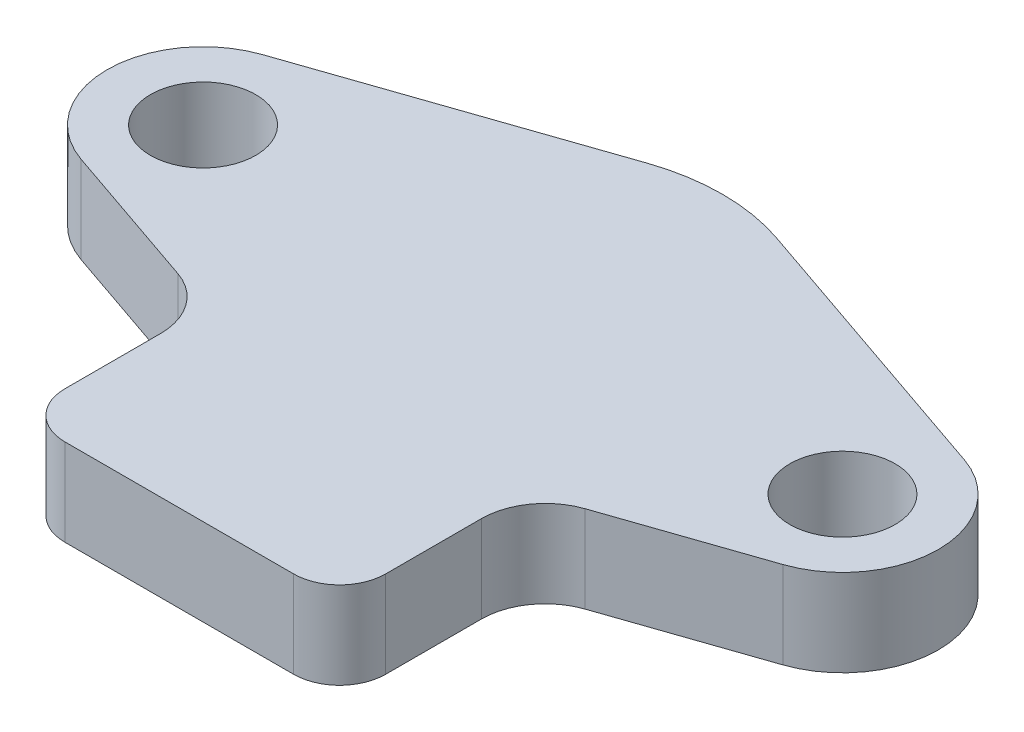
ISO-10303-21;
HEADER;
FILE_DESCRIPTION(('STEP AP214'),'2;1');
FILE_NAME('part.step','',(''),(''),'','','');
FILE_SCHEMA(('AUTOMOTIVE_DESIGN { 1 0 10303 214 1 1 1 1 }'));
ENDSEC;
DATA;
#1=APPLICATION_CONTEXT('core data for automotive mechanical design processes');
#2=APPLICATION_PROTOCOL_DEFINITION('international standard','automotive_design',2000,#1);
#3=PRODUCT_CONTEXT('',#1,'mechanical');
#4=PRODUCT('Part','Part','',(#3));
#5=PRODUCT_RELATED_PRODUCT_CATEGORY('part','',(#4));
#6=PRODUCT_DEFINITION_FORMATION('','',#4);
#7=PRODUCT_DEFINITION_CONTEXT('part definition',#1,'design');
#8=PRODUCT_DEFINITION('design','',#6,#7);
#9=PRODUCT_DEFINITION_SHAPE('','',#8);
#10=(LENGTH_UNIT() NAMED_UNIT(*) SI_UNIT(.MILLI.,.METRE.));
#11=(NAMED_UNIT(*) PLANE_ANGLE_UNIT() SI_UNIT($,.RADIAN.));
#12=(NAMED_UNIT(*) SI_UNIT($,.STERADIAN.) SOLID_ANGLE_UNIT());
#13=UNCERTAINTY_MEASURE_WITH_UNIT(LENGTH_MEASURE(1.E-05),#10,'distance_accuracy_value','');
#14=(GEOMETRIC_REPRESENTATION_CONTEXT(3) GLOBAL_UNCERTAINTY_ASSIGNED_CONTEXT((#13)) GLOBAL_UNIT_ASSIGNED_CONTEXT((#10,
#11,#12)) REPRESENTATION_CONTEXT('',''));
#15=CARTESIAN_POINT('',(0.,0.,0.));
#16=DIRECTION('',(0.,0.,1.));
#17=DIRECTION('',(1.,0.,0.));
#18=AXIS2_PLACEMENT_3D('',#15,#16,#17);
#19=CARTESIAN_POINT('',(-7.96290000000003,1.143,0.));
#20=DIRECTION('',(1.,0.,0.));
#21=DIRECTION('',(0.,0.,-1.));
#22=AXIS2_PLACEMENT_3D('',#19,#20,#21);
#23=PLANE('',#22);
#24=DIRECTION('',(0.,0.,1.));
#25=VECTOR('',#24,1.);
#26=CARTESIAN_POINT('',(-7.96290000000003,0.,0.));
#27=LINE('',#26,#25);
#28=CARTESIAN_POINT('',(-7.96290000000001,0.,10.0193309149365));
#29=VERTEX_POINT('',#28);
#30=CARTESIAN_POINT('',(-7.9629,0.,14.7701));
#31=VERTEX_POINT('',#30);
#32=EDGE_CURVE('E222',#29,#31,#27,.T.);
#33=ORIENTED_EDGE('',*,*,#32,.T.);
#34=DIRECTION('',(0.,-1.,0.));
#35=VECTOR('',#34,1.);
#36=CARTESIAN_POINT('',(-7.9629,1.143,14.7701));
#37=LINE('',#36,#35);
#38=CARTESIAN_POINT('',(-7.9629,4.318,14.7701));
#39=VERTEX_POINT('',#38);
#40=EDGE_CURVE('E11',#39,#31,#37,.T.);
#41=ORIENTED_EDGE('',*,*,#40,.F.);
#42=DIRECTION('',(0.,0.,1.));
#43=VECTOR('',#42,1.);
#44=CARTESIAN_POINT('',(-7.96290000000001,4.318,10.0193309149365));
#45=LINE('',#44,#43);
#46=CARTESIAN_POINT('',(-7.96290000000001,4.318,10.0193309149365));
#47=VERTEX_POINT('',#46);
#48=EDGE_CURVE('E377',#47,#39,#45,.T.);
#49=ORIENTED_EDGE('',*,*,#48,.F.);
#50=DIRECTION('',(0.,-1.,0.));
#51=VECTOR('',#50,1.);
#52=CARTESIAN_POINT('',(-7.96290000000001,1.143,10.0193309149365));
#53=LINE('',#52,#51);
#54=EDGE_CURVE('E135',#47,#29,#53,.T.);
#55=ORIENTED_EDGE('',*,*,#54,.T.);
#56=EDGE_LOOP('',(#33,#41,#49,#55));
#57=FACE_BOUND('',#56,.T.);
#58=ADVANCED_FACE('F41',(#57),#23,.F.);
#59=CARTESIAN_POINT('',(-5.6769,1.143,14.7701));
#60=DIRECTION('',(0.,-1.,0.));
#61=DIRECTION('',(0.,0.,-1.));
#62=AXIS2_PLACEMENT_3D('',#59,#60,#61);
#63=CYLINDRICAL_SURFACE('',#62,2.286);
#64=CARTESIAN_POINT('',(-5.6769,0.,14.7701));
#65=DIRECTION('',(0.,1.,0.));
#66=DIRECTION('',(0.,0.,1.));
#67=AXIS2_PLACEMENT_3D('',#64,#65,#66);
#68=CIRCLE('',#67,2.286);
#69=CARTESIAN_POINT('',(-5.6769,0.,17.0561));
#70=VERTEX_POINT('',#69);
#71=EDGE_CURVE('E225',#31,#70,#68,.T.);
#72=ORIENTED_EDGE('',*,*,#71,.T.);
#73=DIRECTION('',(0.,-1.,0.));
#74=VECTOR('',#73,1.);
#75=CARTESIAN_POINT('',(-5.6769,1.143,17.0561));
#76=LINE('',#75,#74);
#77=CARTESIAN_POINT('',(-5.6769,4.318,17.0561));
#78=VERTEX_POINT('',#77);
#79=EDGE_CURVE('E52',#78,#70,#76,.T.);
#80=ORIENTED_EDGE('',*,*,#79,.F.);
#81=CARTESIAN_POINT('',(-5.6769,4.318,14.7701));
#82=DIRECTION('',(0.,1.,0.));
#83=DIRECTION('',(0.,0.,1.));
#84=AXIS2_PLACEMENT_3D('',#81,#82,#83);
#85=CIRCLE('',#84,2.286);
#86=EDGE_CURVE('E382',#39,#78,#85,.T.);
#87=ORIENTED_EDGE('',*,*,#86,.F.);
#88=ORIENTED_EDGE('',*,*,#40,.T.);
#89=EDGE_LOOP('',(#72,#80,#87,#88));
#90=FACE_BOUND('',#89,.T.);
#91=ADVANCED_FACE('F450',(#90),#63,.T.);
#92=CARTESIAN_POINT('',(0.,1.143,17.0561));
#93=DIRECTION('',(0.,0.,-1.));
#94=DIRECTION('',(-1.,0.,0.));
#95=AXIS2_PLACEMENT_3D('',#92,#93,#94);
#96=PLANE('',#95);
#97=DIRECTION('',(1.,0.,0.));
#98=VECTOR('',#97,1.);
#99=CARTESIAN_POINT('',(0.,0.,17.0561));
#100=LINE('',#99,#98);
#101=CARTESIAN_POINT('',(5.6769,0.,17.0561));
#102=VERTEX_POINT('',#101);
#103=EDGE_CURVE('E228',#70,#102,#100,.T.);
#104=ORIENTED_EDGE('',*,*,#103,.T.);
#105=DIRECTION('',(0.,-1.,0.));
#106=VECTOR('',#105,1.);
#107=CARTESIAN_POINT('',(5.6769,1.143,17.0561));
#108=LINE('',#107,#106);
#109=CARTESIAN_POINT('',(5.6769,4.318,17.0561));
#110=VERTEX_POINT('',#109);
#111=EDGE_CURVE('E305',#110,#102,#108,.T.);
#112=ORIENTED_EDGE('',*,*,#111,.F.);
#113=DIRECTION('',(1.,0.,0.));
#114=VECTOR('',#113,1.);
#115=CARTESIAN_POINT('',(-5.6769,4.318,17.0561));
#116=LINE('',#115,#114);
#117=EDGE_CURVE('E398',#78,#110,#116,.T.);
#118=ORIENTED_EDGE('',*,*,#117,.F.);
#119=ORIENTED_EDGE('',*,*,#79,.T.);
#120=EDGE_LOOP('',(#104,#112,#118,#119));
#121=FACE_BOUND('',#120,.T.);
#122=ADVANCED_FACE('F454',(#121),#96,.F.);
#123=CARTESIAN_POINT('',(5.6769,1.143,14.7701));
#124=DIRECTION('',(0.,-1.,0.));
#125=DIRECTION('',(0.,0.,-1.));
#126=AXIS2_PLACEMENT_3D('',#123,#124,#125);
#127=CYLINDRICAL_SURFACE('',#126,2.286);
#128=CARTESIAN_POINT('',(5.6769,0.,14.7701));
#129=DIRECTION('',(0.,1.,0.));
#130=DIRECTION('',(0.,0.,1.));
#131=AXIS2_PLACEMENT_3D('',#128,#129,#130);
#132=CIRCLE('',#131,2.286);
#133=CARTESIAN_POINT('',(7.9629,0.,14.7701));
#134=VERTEX_POINT('',#133);
#135=EDGE_CURVE('E231',#102,#134,#132,.T.);
#136=ORIENTED_EDGE('',*,*,#135,.T.);
#137=DIRECTION('',(0.,-1.,0.));
#138=VECTOR('',#137,1.);
#139=CARTESIAN_POINT('',(7.9629,1.143,14.7701));
#140=LINE('',#139,#138);
#141=CARTESIAN_POINT('',(7.96290000000001,4.318,14.7701));
#142=VERTEX_POINT('',#141);
#143=EDGE_CURVE('E301',#142,#134,#140,.T.);
#144=ORIENTED_EDGE('',*,*,#143,.F.);
#145=CARTESIAN_POINT('',(5.6769,4.318,14.7701));
#146=DIRECTION('',(0.,1.,0.));
#147=DIRECTION('',(0.,0.,1.));
#148=AXIS2_PLACEMENT_3D('',#145,#146,#147);
#149=CIRCLE('',#148,2.286);
#150=EDGE_CURVE('E402',#110,#142,#149,.T.);
#151=ORIENTED_EDGE('',*,*,#150,.F.);
#152=ORIENTED_EDGE('',*,*,#111,.T.);
#153=EDGE_LOOP('',(#136,#144,#151,#152));
#154=FACE_BOUND('',#153,.T.);
#155=ADVANCED_FACE('F456',(#154),#127,.T.);
#156=CARTESIAN_POINT('',(7.9629,1.143,0.));
#157=DIRECTION('',(-1.,0.,0.));
#158=DIRECTION('',(0.,0.,1.));
#159=AXIS2_PLACEMENT_3D('',#156,#157,#158);
#160=PLANE('',#159);
#161=DIRECTION('',(0.,0.,-1.));
#162=VECTOR('',#161,1.);
#163=CARTESIAN_POINT('',(7.9629,0.,0.));
#164=LINE('',#163,#162);
#165=CARTESIAN_POINT('',(7.9629,0.,10.0193309149367));
#166=VERTEX_POINT('',#165);
#167=EDGE_CURVE('E234',#134,#166,#164,.T.);
#168=ORIENTED_EDGE('',*,*,#167,.T.);
#169=DIRECTION('',(0.,-1.,0.));
#170=VECTOR('',#169,1.);
#171=CARTESIAN_POINT('',(7.9629,1.143,10.0193309149367));
#172=LINE('',#171,#170);
#173=CARTESIAN_POINT('',(7.9629,4.318,10.0193309149367));
#174=VERTEX_POINT('',#173);
#175=EDGE_CURVE('E298',#174,#166,#172,.T.);
#176=ORIENTED_EDGE('',*,*,#175,.F.);
#177=DIRECTION('',(0.,0.,-1.));
#178=VECTOR('',#177,1.);
#179=CARTESIAN_POINT('',(7.9629,4.318,14.7701));
#180=LINE('',#179,#178);
#181=EDGE_CURVE('E406',#142,#174,#180,.T.);
#182=ORIENTED_EDGE('',*,*,#181,.F.);
#183=ORIENTED_EDGE('',*,*,#143,.T.);
#184=EDGE_LOOP('',(#168,#176,#182,#183));
#185=FACE_BOUND('',#184,.T.);
#186=ADVANCED_FACE('F461',(#185),#160,.F.);
#187=CARTESIAN_POINT('',(11.1379,1.143,10.0193309149367));
#188=DIRECTION('',(0.,-1.,0.));
#189=DIRECTION('',(0.,0.,-1.));
#190=AXIS2_PLACEMENT_3D('',#187,#188,#189);
#191=CYLINDRICAL_SURFACE('',#190,3.175);
#192=CARTESIAN_POINT('',(11.1379,0.,10.0193309149367));
#193=DIRECTION('',(0.,1.,0.));
#194=DIRECTION('',(0.,0.,1.));
#195=AXIS2_PLACEMENT_3D('',#192,#193,#194);
#196=CIRCLE('',#195,3.175);
#197=CARTESIAN_POINT('',(10.10666,0.,7.01647076794347));
#198=VERTEX_POINT('',#197);
#199=EDGE_CURVE('E238',#198,#166,#196,.T.);
#200=ORIENTED_EDGE('',*,*,#199,.F.);
#201=DIRECTION('',(0.,-1.,0.));
#202=VECTOR('',#201,1.);
#203=CARTESIAN_POINT('',(10.10666,1.143,7.01647076794347));
#204=LINE('',#203,#202);
#205=CARTESIAN_POINT('',(10.10666,4.318,7.01647076794347));
#206=VERTEX_POINT('',#205);
#207=EDGE_CURVE('E295',#206,#198,#204,.T.);
#208=ORIENTED_EDGE('',*,*,#207,.F.);
#209=CARTESIAN_POINT('',(11.1379,4.318,10.0193309149367));
#210=DIRECTION('',(0.,-1.,0.));
#211=DIRECTION('',(0.,0.,1.));
#212=AXIS2_PLACEMENT_3D('',#209,#210,#211);
#213=CIRCLE('',#212,3.175);
#214=EDGE_CURVE('E410',#174,#206,#213,.T.);
#215=ORIENTED_EDGE('',*,*,#214,.F.);
#216=ORIENTED_EDGE('',*,*,#175,.T.);
#217=EDGE_LOOP('',(#200,#208,#215,#216));
#218=FACE_BOUND('',#217,.T.);
#219=ADVANCED_FACE('F466',(#218),#191,.F.);
#220=CARTESIAN_POINT('',(3.22159375999992,1.143,9.38093509920677));
#221=DIRECTION('',(-0.324799999999992,0.,-0.945782723462427));
#222=DIRECTION('',(-0.945782723462427,0.,0.324799999999992));
#223=AXIS2_PLACEMENT_3D('',#220,#221,#222);
#224=PLANE('',#223);
#225=DIRECTION('',(0.945782723462427,0.,-0.324799999999992));
#226=VECTOR('',#225,1.);
#227=CARTESIAN_POINT('',(3.22159375999992,0.,9.38093509920677));
#228=LINE('',#227,#226);
#229=CARTESIAN_POINT('',(17.42186,0.,4.50429022048992));
#230=VERTEX_POINT('',#229);
#231=EDGE_CURVE('E242',#198,#230,#228,.T.);
#232=ORIENTED_EDGE('',*,*,#231,.T.);
#233=DIRECTION('',(0.,-1.,0.));
#234=VECTOR('',#233,1.);
#235=CARTESIAN_POINT('',(17.42186,1.143,4.50429022048992));
#236=LINE('',#235,#234);
#237=CARTESIAN_POINT('',(17.42186,4.318,4.50429022048992));
#238=VERTEX_POINT('',#237);
#239=EDGE_CURVE('E291',#238,#230,#236,.T.);
#240=ORIENTED_EDGE('',*,*,#239,.F.);
#241=DIRECTION('',(0.945782723462427,0.,-0.324799999999992));
#242=VECTOR('',#241,1.);
#243=CARTESIAN_POINT('',(10.10666,4.318,7.01647076794347));
#244=LINE('',#243,#242);
#245=EDGE_CURVE('E414',#206,#238,#244,.T.);
#246=ORIENTED_EDGE('',*,*,#245,.F.);
#247=ORIENTED_EDGE('',*,*,#207,.T.);
#248=EDGE_LOOP('',(#232,#240,#246,#247));
#249=FACE_BOUND('',#248,.T.);
#250=ADVANCED_FACE('F468',(#249),#224,.F.);
#251=CARTESIAN_POINT('',(15.875,1.143,1.12757025938492E-13));
#252=DIRECTION('',(0.,-1.,0.));
#253=DIRECTION('',(0.,0.,-1.));
#254=AXIS2_PLACEMENT_3D('',#251,#252,#253);
#255=CYLINDRICAL_SURFACE('',#254,4.76250000000001);
#256=CARTESIAN_POINT('',(15.875,0.,1.12757025938492E-13));
#257=DIRECTION('',(0.,1.,0.));
#258=DIRECTION('',(0.,0.,1.));
#259=AXIS2_PLACEMENT_3D('',#256,#257,#258);
#260=CIRCLE('',#259,4.76250000000001);
#261=CARTESIAN_POINT('',(17.42186,0.,-4.50429022048968));
#262=VERTEX_POINT('',#261);
#263=EDGE_CURVE('E245',#230,#262,#260,.T.);
#264=ORIENTED_EDGE('',*,*,#263,.T.);
#265=DIRECTION('',(0.,-1.,0.));
#266=VECTOR('',#265,1.);
#267=CARTESIAN_POINT('',(17.42186,1.143,-4.50429022048968));
#268=LINE('',#267,#266);
#269=CARTESIAN_POINT('',(17.42186,4.318,-4.50429022048969));
#270=VERTEX_POINT('',#269);
#271=EDGE_CURVE('E287',#270,#262,#268,.T.);
#272=ORIENTED_EDGE('',*,*,#271,.F.);
#273=CARTESIAN_POINT('',(15.875,4.318,1.12757025938492E-13));
#274=DIRECTION('',(0.,1.,0.));
#275=DIRECTION('',(0.,0.,1.));
#276=AXIS2_PLACEMENT_3D('',#273,#274,#275);
#277=CIRCLE('',#276,4.76250000000001);
#278=EDGE_CURVE('E418',#238,#270,#277,.T.);
#279=ORIENTED_EDGE('',*,*,#278,.F.);
#280=ORIENTED_EDGE('',*,*,#239,.T.);
#281=EDGE_LOOP('',(#264,#272,#279,#280));
#282=FACE_BOUND('',#281,.T.);
#283=ADVANCED_FACE('F473',(#282),#255,.T.);
#284=CARTESIAN_POINT('',(3.22159376000007,1.143,-9.38093509920672));
#285=DIRECTION('',(-0.324800000000007,0.,0.945782723462422));
#286=DIRECTION('',(0.945782723462422,0.,0.324800000000007));
#287=AXIS2_PLACEMENT_3D('',#284,#285,#286);
#288=PLANE('',#287);
#289=DIRECTION('',(-0.945782723462422,0.,-0.324800000000007));
#290=VECTOR('',#289,1.);
#291=CARTESIAN_POINT('',(3.22159376000007,0.,-9.38093509920672));
#292=LINE('',#291,#290);
#293=CARTESIAN_POINT('',(3.22159376000007,0.,-9.38093509920672));
#294=VERTEX_POINT('',#293);
#295=EDGE_CURVE('E248',#262,#294,#292,.T.);
#296=ORIENTED_EDGE('',*,*,#295,.T.);
#297=DIRECTION('',(0.,-1.,0.));
#298=VECTOR('',#297,1.);
#299=CARTESIAN_POINT('',(3.22159376000007,1.143,-9.38093509920672));
#300=LINE('',#299,#298);
#301=CARTESIAN_POINT('',(3.22159376000007,4.318,-9.38093509920672));
#302=VERTEX_POINT('',#301);
#303=EDGE_CURVE('E283',#302,#294,#300,.T.);
#304=ORIENTED_EDGE('',*,*,#303,.F.);
#305=DIRECTION('',(-0.945782723462422,0.,-0.324800000000006));
#306=VECTOR('',#305,1.);
#307=CARTESIAN_POINT('',(17.42186,4.318,-4.50429022048969));
#308=LINE('',#307,#306);
#309=EDGE_CURVE('E422',#270,#302,#308,.T.);
#310=ORIENTED_EDGE('',*,*,#309,.F.);
#311=ORIENTED_EDGE('',*,*,#271,.T.);
#312=EDGE_LOOP('',(#296,#304,#310,#311));
#313=FACE_BOUND('',#312,.T.);
#314=ADVANCED_FACE('F477',(#313),#288,.F.);
#315=CARTESIAN_POINT('',(0.,1.143,0.));
#316=DIRECTION('',(0.,-1.,0.));
#317=DIRECTION('',(0.,0.,-1.));
#318=AXIS2_PLACEMENT_3D('',#315,#316,#317);
#319=CYLINDRICAL_SURFACE('',#318,9.9187);
#320=CARTESIAN_POINT('',(0.,0.,0.));
#321=DIRECTION('',(0.,1.,0.));
#322=DIRECTION('',(0.,0.,1.));
#323=AXIS2_PLACEMENT_3D('',#320,#321,#322);
#324=CIRCLE('',#323,9.9187);
#325=CARTESIAN_POINT('',(-3.22159375999994,0.,-9.38093509920677));
#326=VERTEX_POINT('',#325);
#327=EDGE_CURVE('E251',#294,#326,#324,.T.);
#328=ORIENTED_EDGE('',*,*,#327,.T.);
#329=DIRECTION('',(0.,-1.,0.));
#330=VECTOR('',#329,1.);
#331=CARTESIAN_POINT('',(-3.22159375999994,1.143,-9.38093509920677));
#332=LINE('',#331,#330);
#333=CARTESIAN_POINT('',(-3.22159375999993,4.318,-9.38093509920677));
#334=VERTEX_POINT('',#333);
#335=EDGE_CURVE('E279',#334,#326,#332,.T.);
#336=ORIENTED_EDGE('',*,*,#335,.F.);
#337=CARTESIAN_POINT('',(0.,4.318,0.));
#338=DIRECTION('',(0.,1.,0.));
#339=DIRECTION('',(0.,0.,1.));
#340=AXIS2_PLACEMENT_3D('',#337,#338,#339);
#341=CIRCLE('',#340,9.9187);
#342=EDGE_CURVE('E426',#302,#334,#341,.T.);
#343=ORIENTED_EDGE('',*,*,#342,.F.);
#344=ORIENTED_EDGE('',*,*,#303,.T.);
#345=EDGE_LOOP('',(#328,#336,#343,#344));
#346=FACE_BOUND('',#345,.T.);
#347=ADVANCED_FACE('F480',(#346),#319,.T.);
#348=CARTESIAN_POINT('',(-3.22159375999993,1.143,-9.38093509920678));
#349=DIRECTION('',(0.324799999999993,0.,0.945782723462426));
#350=DIRECTION('',(0.945782723462427,0.,-0.324799999999993));
#351=AXIS2_PLACEMENT_3D('',#348,#349,#350);
#352=PLANE('',#351);
#353=DIRECTION('',(-0.945782723462427,0.,0.324799999999993));
#354=VECTOR('',#353,1.);
#355=CARTESIAN_POINT('',(-3.22159375999993,0.,-9.38093509920678));
#356=LINE('',#355,#354);
#357=CARTESIAN_POINT('',(-17.42186,0.,-4.50429022048992));
#358=VERTEX_POINT('',#357);
#359=EDGE_CURVE('E254',#326,#358,#356,.T.);
#360=ORIENTED_EDGE('',*,*,#359,.T.);
#361=DIRECTION('',(0.,-1.,0.));
#362=VECTOR('',#361,1.);
#363=CARTESIAN_POINT('',(-17.42186,1.143,-4.50429022048992));
#364=LINE('',#363,#362);
#365=CARTESIAN_POINT('',(-17.42186,4.318,-4.50429022048992));
#366=VERTEX_POINT('',#365);
#367=EDGE_CURVE('E275',#366,#358,#364,.T.);
#368=ORIENTED_EDGE('',*,*,#367,.F.);
#369=DIRECTION('',(-0.945782723462426,0.,0.324799999999992));
#370=VECTOR('',#369,1.);
#371=CARTESIAN_POINT('',(-3.22159375999993,4.318,-9.38093509920677));
#372=LINE('',#371,#370);
#373=EDGE_CURVE('E430',#334,#366,#372,.T.);
#374=ORIENTED_EDGE('',*,*,#373,.F.);
#375=ORIENTED_EDGE('',*,*,#335,.T.);
#376=EDGE_LOOP('',(#360,#368,#374,#375));
#377=FACE_BOUND('',#376,.T.);
#378=ADVANCED_FACE('F482',(#377),#352,.F.);
#379=CARTESIAN_POINT('',(-15.875,1.143,-1.11022302462516E-13));
#380=DIRECTION('',(0.,-1.,0.));
#381=DIRECTION('',(0.,0.,-1.));
#382=AXIS2_PLACEMENT_3D('',#379,#380,#381);
#383=CYLINDRICAL_SURFACE('',#382,4.76250000000001);
#384=CARTESIAN_POINT('',(-15.875,0.,-1.11022302462516E-13));
#385=DIRECTION('',(0.,1.,0.));
#386=DIRECTION('',(0.,0.,1.));
#387=AXIS2_PLACEMENT_3D('',#384,#385,#386);
#388=CIRCLE('',#387,4.76250000000001);
#389=CARTESIAN_POINT('',(-17.42186,0.,4.50429022048969));
#390=VERTEX_POINT('',#389);
#391=EDGE_CURVE('E257',#358,#390,#388,.T.);
#392=ORIENTED_EDGE('',*,*,#391,.T.);
#393=DIRECTION('',(0.,-1.,0.));
#394=VECTOR('',#393,1.);
#395=CARTESIAN_POINT('',(-17.42186,1.143,4.50429022048969));
#396=LINE('',#395,#394);
#397=CARTESIAN_POINT('',(-17.42186,4.318,4.50429022048969));
#398=VERTEX_POINT('',#397);
#399=EDGE_CURVE('E271',#398,#390,#396,.T.);
#400=ORIENTED_EDGE('',*,*,#399,.F.);
#401=CARTESIAN_POINT('',(-15.875,4.318,-1.11022302462516E-13));
#402=DIRECTION('',(0.,1.,0.));
#403=DIRECTION('',(0.,0.,1.));
#404=AXIS2_PLACEMENT_3D('',#401,#402,#403);
#405=CIRCLE('',#404,4.76250000000001);
#406=EDGE_CURVE('E434',#366,#398,#405,.T.);
#407=ORIENTED_EDGE('',*,*,#406,.F.);
#408=ORIENTED_EDGE('',*,*,#367,.T.);
#409=EDGE_LOOP('',(#392,#400,#407,#408));
#410=FACE_BOUND('',#409,.T.);
#411=ADVANCED_FACE('F483',(#410),#383,.T.);
#412=CARTESIAN_POINT('',(-3.22159376000007,1.143,9.38093509920673));
#413=DIRECTION('',(0.324800000000007,0.,-0.945782723462422));
#414=DIRECTION('',(-0.945782723462422,0.,-0.324800000000007));
#415=AXIS2_PLACEMENT_3D('',#412,#413,#414);
#416=PLANE('',#415);
#417=DIRECTION('',(0.945782723462422,0.,0.324800000000007));
#418=VECTOR('',#417,1.);
#419=CARTESIAN_POINT('',(-3.22159376000007,0.,9.38093509920673));
#420=LINE('',#419,#418);
#421=CARTESIAN_POINT('',(-10.10666,0.,7.01647076794336));
#422=VERTEX_POINT('',#421);
#423=EDGE_CURVE('E260',#390,#422,#420,.T.);
#424=ORIENTED_EDGE('',*,*,#423,.T.);
#425=DIRECTION('',(0.,-1.,0.));
#426=VECTOR('',#425,1.);
#427=CARTESIAN_POINT('',(-10.10666,1.143,7.01647076794336));
#428=LINE('',#427,#426);
#429=CARTESIAN_POINT('',(-10.10666,4.318,7.01647076794336));
#430=VERTEX_POINT('',#429);
#431=EDGE_CURVE('E127',#430,#422,#428,.T.);
#432=ORIENTED_EDGE('',*,*,#431,.F.);
#433=DIRECTION('',(0.945782723462422,0.,0.324800000000006));
#434=VECTOR('',#433,1.);
#435=CARTESIAN_POINT('',(-17.42186,4.318,4.50429022048969));
#436=LINE('',#435,#434);
#437=EDGE_CURVE('E197',#398,#430,#436,.T.);
#438=ORIENTED_EDGE('',*,*,#437,.F.);
#439=ORIENTED_EDGE('',*,*,#399,.T.);
#440=EDGE_LOOP('',(#424,#432,#438,#439));
#441=FACE_BOUND('',#440,.T.);
#442=ADVANCED_FACE('F442',(#441),#416,.F.);
#443=CARTESIAN_POINT('',(0.,1.143,0.));
#444=DIRECTION('',(0.,-1.,0.));
#445=DIRECTION('',(0.,0.,-1.));
#446=AXIS2_PLACEMENT_3D('',#443,#444,#445);
#447=CYLINDRICAL_SURFACE('',#446,8.3312);
#448=CARTESIAN_POINT('',(0.,0.,0.));
#449=DIRECTION('',(0.,1.,0.));
#450=DIRECTION('',(0.,0.,1.));
#451=AXIS2_PLACEMENT_3D('',#448,#449,#450);
#452=CIRCLE('',#451,8.3312);
#453=CARTESIAN_POINT('',(6.79650526315789,0.,4.81834096426011));
#454=VERTEX_POINT('',#453);
#455=CARTESIAN_POINT('',(-6.7965052631579,0.,4.81834096426011));
#456=VERTEX_POINT('',#455);
#457=EDGE_CURVE('E196',#454,#456,#452,.T.);
#458=ORIENTED_EDGE('',*,*,#457,.F.);
#459=DIRECTION('',(0.,-1.,0.));
#460=VECTOR('',#459,1.);
#461=CARTESIAN_POINT('',(6.79650526315789,1.143,4.81834096426011));
#462=LINE('',#461,#460);
#463=CARTESIAN_POINT('',(6.79650526315789,1.143,4.81834096426011));
#464=VERTEX_POINT('',#463);
#465=EDGE_CURVE('E45',#464,#454,#462,.T.);
#466=ORIENTED_EDGE('',*,*,#465,.F.);
#467=CARTESIAN_POINT('',(0.,1.143,0.));
#468=DIRECTION('',(0.,1.,0.));
#469=DIRECTION('',(0.,0.,1.));
#470=AXIS2_PLACEMENT_3D('',#467,#468,#469);
#471=CIRCLE('',#470,8.3312);
#472=CARTESIAN_POINT('',(-6.7965052631579,1.143,4.81834096426011));
#473=VERTEX_POINT('',#472);
#474=EDGE_CURVE('E181',#464,#473,#471,.T.);
#475=ORIENTED_EDGE('',*,*,#474,.T.);
#476=DIRECTION('',(0.,-1.,0.));
#477=VECTOR('',#476,1.);
#478=CARTESIAN_POINT('',(-6.7965052631579,1.143,4.81834096426011));
#479=LINE('',#478,#477);
#480=EDGE_CURVE('E191',#473,#456,#479,.T.);
#481=ORIENTED_EDGE('',*,*,#480,.T.);
#482=EDGE_LOOP('',(#458,#466,#475,#481));
#483=FACE_BOUND('',#482,.T.);
#484=ADVANCED_FACE('F326',(#483),#447,.F.);
#485=CARTESIAN_POINT('',(8.6614,1.143,6.14044671664856));
#486=DIRECTION('',(0.,-1.,0.));
#487=DIRECTION('',(0.,0.,-1.));
#488=AXIS2_PLACEMENT_3D('',#485,#486,#487);
#489=CYLINDRICAL_SURFACE('',#488,2.286);
#490=CARTESIAN_POINT('',(8.6614,0.,6.14044671664856));
#491=DIRECTION('',(0.,1.,0.));
#492=DIRECTION('',(0.,0.,1.));
#493=AXIS2_PLACEMENT_3D('',#490,#491,#492);
#494=CIRCLE('',#493,2.286);
#495=CARTESIAN_POINT('',(6.3754,0.,6.14044671664856));
#496=VERTEX_POINT('',#495);
#497=EDGE_CURVE('E201',#454,#496,#494,.T.);
#498=ORIENTED_EDGE('',*,*,#497,.T.);
#499=DIRECTION('',(0.,-1.,0.));
#500=VECTOR('',#499,1.);
#501=CARTESIAN_POINT('',(6.3754,1.143,6.14044671664856));
#502=LINE('',#501,#500);
#503=CARTESIAN_POINT('',(6.3754,1.143,6.14044671664856));
#504=VERTEX_POINT('',#503);
#505=EDGE_CURVE('E164',#504,#496,#502,.T.);
#506=ORIENTED_EDGE('',*,*,#505,.F.);
#507=CARTESIAN_POINT('',(8.6614,1.143,6.14044671664856));
#508=DIRECTION('',(0.,1.,0.));
#509=DIRECTION('',(0.,0.,1.));
#510=AXIS2_PLACEMENT_3D('',#507,#508,#509);
#511=CIRCLE('',#510,2.286);
#512=EDGE_CURVE('E177',#464,#504,#511,.T.);
#513=ORIENTED_EDGE('',*,*,#512,.F.);
#514=ORIENTED_EDGE('',*,*,#465,.T.);
#515=EDGE_LOOP('',(#498,#506,#513,#514));
#516=FACE_BOUND('',#515,.T.);
#517=ADVANCED_FACE('F321',(#516),#489,.T.);
#518=CARTESIAN_POINT('',(6.3754,1.143,0.));
#519=DIRECTION('',(-1.,0.,0.));
#520=DIRECTION('',(0.,0.,1.));
#521=AXIS2_PLACEMENT_3D('',#518,#519,#520);
#522=PLANE('',#521);
#523=DIRECTION('',(0.,0.,-1.));
#524=VECTOR('',#523,1.);
#525=CARTESIAN_POINT('',(6.3754,0.,0.));
#526=LINE('',#525,#524);
#527=CARTESIAN_POINT('',(6.3754,0.,15.4686));
#528=VERTEX_POINT('',#527);
#529=EDGE_CURVE('E159',#528,#496,#526,.T.);
#530=ORIENTED_EDGE('',*,*,#529,.F.);
#531=DIRECTION('',(0.,-1.,0.));
#532=VECTOR('',#531,1.);
#533=CARTESIAN_POINT('',(6.3754,1.143,15.4686));
#534=LINE('',#533,#532);
#535=CARTESIAN_POINT('',(6.3754,1.143,15.4686));
#536=VERTEX_POINT('',#535);
#537=EDGE_CURVE('E152',#536,#528,#534,.T.);
#538=ORIENTED_EDGE('',*,*,#537,.F.);
#539=DIRECTION('',(0.,0.,-1.));
#540=VECTOR('',#539,1.);
#541=CARTESIAN_POINT('',(6.3754,1.143,0.));
#542=LINE('',#541,#540);
#543=EDGE_CURVE('E156',#536,#504,#542,.T.);
#544=ORIENTED_EDGE('',*,*,#543,.T.);
#545=ORIENTED_EDGE('',*,*,#505,.T.);
#546=EDGE_LOOP('',(#530,#538,#544,#545));
#547=FACE_BOUND('',#546,.T.);
#548=ADVANCED_FACE('F154',(#547),#522,.T.);
#549=CARTESIAN_POINT('',(0.,1.143,15.4686));
#550=DIRECTION('',(0.,0.,-1.));
#551=DIRECTION('',(-1.,0.,0.));
#552=AXIS2_PLACEMENT_3D('',#549,#550,#551);
#553=PLANE('',#552);
#554=DIRECTION('',(1.,0.,0.));
#555=VECTOR('',#554,1.);
#556=CARTESIAN_POINT('',(0.,0.,15.4686));
#557=LINE('',#556,#555);
#558=CARTESIAN_POINT('',(-6.3754,0.,15.4686));
#559=VERTEX_POINT('',#558);
#560=EDGE_CURVE('E207',#559,#528,#557,.T.);
#561=ORIENTED_EDGE('',*,*,#560,.F.);
#562=DIRECTION('',(0.,-1.,0.));
#563=VECTOR('',#562,1.);
#564=CARTESIAN_POINT('',(-6.3754,1.143,15.4686));
#565=LINE('',#564,#563);
#566=CARTESIAN_POINT('',(-6.3754,1.143,15.4686));
#567=VERTEX_POINT('',#566);
#568=EDGE_CURVE('E165',#567,#559,#565,.T.);
#569=ORIENTED_EDGE('',*,*,#568,.F.);
#570=DIRECTION('',(1.,0.,0.));
#571=VECTOR('',#570,1.);
#572=CARTESIAN_POINT('',(0.,1.143,15.4686));
#573=LINE('',#572,#571);
#574=EDGE_CURVE('E168',#567,#536,#573,.T.);
#575=ORIENTED_EDGE('',*,*,#574,.T.);
#576=ORIENTED_EDGE('',*,*,#537,.T.);
#577=EDGE_LOOP('',(#561,#569,#575,#576));
#578=FACE_BOUND('',#577,.T.);
#579=ADVANCED_FACE('F169',(#578),#553,.T.);
#580=CARTESIAN_POINT('',(-6.3754,1.143,0.));
#581=DIRECTION('',(1.,0.,0.));
#582=DIRECTION('',(0.,0.,-1.));
#583=AXIS2_PLACEMENT_3D('',#580,#581,#582);
#584=PLANE('',#583);
#585=DIRECTION('',(0.,0.,1.));
#586=VECTOR('',#585,1.);
#587=CARTESIAN_POINT('',(-6.3754,0.,0.));
#588=LINE('',#587,#586);
#589=CARTESIAN_POINT('',(-6.3754,0.,6.14044671664855));
#590=VERTEX_POINT('',#589);
#591=EDGE_CURVE('E210',#590,#559,#588,.T.);
#592=ORIENTED_EDGE('',*,*,#591,.F.);
#593=DIRECTION('',(0.,-1.,0.));
#594=VECTOR('',#593,1.);
#595=CARTESIAN_POINT('',(-6.3754,1.143,6.14044671664855));
#596=LINE('',#595,#594);
#597=CARTESIAN_POINT('',(-6.3754,1.143,6.14044671664855));
#598=VERTEX_POINT('',#597);
#599=EDGE_CURVE('E61',#598,#590,#596,.T.);
#600=ORIENTED_EDGE('',*,*,#599,.F.);
#601=DIRECTION('',(0.,0.,1.));
#602=VECTOR('',#601,1.);
#603=CARTESIAN_POINT('',(-6.3754,1.143,0.));
#604=LINE('',#603,#602);
#605=EDGE_CURVE('E173',#598,#567,#604,.T.);
#606=ORIENTED_EDGE('',*,*,#605,.T.);
#607=ORIENTED_EDGE('',*,*,#568,.T.);
#608=EDGE_LOOP('',(#592,#600,#606,#607));
#609=FACE_BOUND('',#608,.T.);
#610=ADVANCED_FACE('F330',(#609),#584,.T.);
#611=CARTESIAN_POINT('',(15.875,1.143,1.12757025938492E-13));
#612=DIRECTION('',(0.,-1.,0.));
#613=DIRECTION('',(0.,0.,-1.));
#614=AXIS2_PLACEMENT_3D('',#611,#612,#613);
#615=CYLINDRICAL_SURFACE('',#614,2.6162);
#616=CARTESIAN_POINT('',(15.875,0.,1.12757025938492E-13));
#617=DIRECTION('',(0.,1.,0.));
#618=DIRECTION('',(0.,0.,1.));
#619=AXIS2_PLACEMENT_3D('',#616,#617,#618);
#620=CIRCLE('',#619,2.6162);
#621=CARTESIAN_POINT('',(15.875,0.,2.61620000000011));
#622=VERTEX_POINT('',#621);
#623=EDGE_CURVE('E218',#622,#622,#620,.T.);
#624=ORIENTED_EDGE('',*,*,#623,.F.);
#625=EDGE_LOOP('',(#624));
#626=FACE_BOUND('',#625,.T.);
#627=CARTESIAN_POINT('',(15.875,4.318,1.12757025938492E-13));
#628=DIRECTION('',(0.,1.,0.));
#629=DIRECTION('',(0.,0.,1.));
#630=AXIS2_PLACEMENT_3D('',#627,#628,#629);
#631=CIRCLE('',#630,2.6162);
#632=CARTESIAN_POINT('',(15.875,4.318,2.61620000000011));
#633=VERTEX_POINT('',#632);
#634=EDGE_CURVE('E388',#633,#633,#631,.T.);
#635=ORIENTED_EDGE('',*,*,#634,.T.);
#636=EDGE_LOOP('',(#635));
#637=FACE_BOUND('',#636,.T.);
#638=ADVANCED_FACE('F500',(#626,#637),#615,.F.);
#639=CARTESIAN_POINT('',(-8.6614,1.143,6.14044671664855));
#640=DIRECTION('',(0.,-1.,0.));
#641=DIRECTION('',(0.,0.,-1.));
#642=AXIS2_PLACEMENT_3D('',#639,#640,#641);
#643=CYLINDRICAL_SURFACE('',#642,2.286);
#644=CARTESIAN_POINT('',(-8.6614,0.,6.14044671664855));
#645=DIRECTION('',(0.,1.,0.));
#646=DIRECTION('',(0.,0.,1.));
#647=AXIS2_PLACEMENT_3D('',#644,#645,#646);
#648=CIRCLE('',#647,2.286);
#649=EDGE_CURVE('E214',#590,#456,#648,.T.);
#650=ORIENTED_EDGE('',*,*,#649,.T.);
#651=ORIENTED_EDGE('',*,*,#480,.F.);
#652=CARTESIAN_POINT('',(-8.6614,1.143,6.14044671664855));
#653=DIRECTION('',(0.,1.,0.));
#654=DIRECTION('',(0.,0.,1.));
#655=AXIS2_PLACEMENT_3D('',#652,#653,#654);
#656=CIRCLE('',#655,2.286);
#657=EDGE_CURVE('E187',#598,#473,#656,.T.);
#658=ORIENTED_EDGE('',*,*,#657,.F.);
#659=ORIENTED_EDGE('',*,*,#599,.T.);
#660=EDGE_LOOP('',(#650,#651,#658,#659));
#661=FACE_BOUND('',#660,.T.);
#662=ADVANCED_FACE('F329',(#661),#643,.T.);
#663=CARTESIAN_POINT('',(-15.875,1.143,-1.11022302462516E-13));
#664=DIRECTION('',(0.,-1.,0.));
#665=DIRECTION('',(0.,0.,-1.));
#666=AXIS2_PLACEMENT_3D('',#663,#664,#665);
#667=CYLINDRICAL_SURFACE('',#666,2.6162);
#668=CARTESIAN_POINT('',(-15.875,0.,-1.11022302462516E-13));
#669=DIRECTION('',(0.,1.,0.));
#670=DIRECTION('',(0.,0.,1.));
#671=AXIS2_PLACEMENT_3D('',#668,#669,#670);
#672=CIRCLE('',#671,2.6162);
#673=CARTESIAN_POINT('',(-15.875,0.,2.61619999999989));
#674=VERTEX_POINT('',#673);
#675=EDGE_CURVE('E192',#674,#674,#672,.T.);
#676=ORIENTED_EDGE('',*,*,#675,.F.);
#677=EDGE_LOOP('',(#676));
#678=FACE_BOUND('',#677,.T.);
#679=CARTESIAN_POINT('',(-15.875,4.318,-1.11022302462516E-13));
#680=DIRECTION('',(0.,1.,0.));
#681=DIRECTION('',(0.,0.,1.));
#682=AXIS2_PLACEMENT_3D('',#679,#680,#681);
#683=CIRCLE('',#682,2.6162);
#684=CARTESIAN_POINT('',(-15.875,4.318,2.61619999999989));
#685=VERTEX_POINT('',#684);
#686=EDGE_CURVE('E392',#685,#685,#683,.T.);
#687=ORIENTED_EDGE('',*,*,#686,.T.);
#688=EDGE_LOOP('',(#687));
#689=FACE_BOUND('',#688,.T.);
#690=ADVANCED_FACE('F43',(#678,#689),#667,.F.);
#691=CARTESIAN_POINT('',(-11.1379,1.143,10.0193309149365));
#692=DIRECTION('',(0.,-1.,0.));
#693=DIRECTION('',(0.,0.,-1.));
#694=AXIS2_PLACEMENT_3D('',#691,#692,#693);
#695=CYLINDRICAL_SURFACE('',#694,3.17499999999999);
#696=CARTESIAN_POINT('',(-11.1379,0.,10.0193309149365));
#697=DIRECTION('',(0.,1.,0.));
#698=DIRECTION('',(0.,0.,1.));
#699=AXIS2_PLACEMENT_3D('',#696,#697,#698);
#700=CIRCLE('',#699,3.17499999999999);
#701=EDGE_CURVE('E263',#29,#422,#700,.T.);
#702=ORIENTED_EDGE('',*,*,#701,.F.);
#703=ORIENTED_EDGE('',*,*,#54,.F.);
#704=CARTESIAN_POINT('',(-11.1379,4.318,10.0193309149365));
#705=DIRECTION('',(0.,-1.,0.));
#706=DIRECTION('',(0.,0.,1.));
#707=AXIS2_PLACEMENT_3D('',#704,#705,#706);
#708=CIRCLE('',#707,3.17499999999999);
#709=EDGE_CURVE('E375',#430,#47,#708,.T.);
#710=ORIENTED_EDGE('',*,*,#709,.F.);
#711=ORIENTED_EDGE('',*,*,#431,.T.);
#712=EDGE_LOOP('',(#702,#703,#710,#711));
#713=FACE_BOUND('',#712,.T.);
#714=ADVANCED_FACE('F373',(#713),#695,.F.);
#715=CARTESIAN_POINT('',(0.,0.,0.));
#716=DIRECTION('',(0.,1.,0.));
#717=DIRECTION('',(0.,0.,1.));
#718=AXIS2_PLACEMENT_3D('',#715,#716,#717);
#719=PLANE('',#718);
#720=ORIENTED_EDGE('',*,*,#675,.T.);
#721=EDGE_LOOP('',(#720));
#722=FACE_BOUND('',#721,.T.);
#723=ORIENTED_EDGE('',*,*,#457,.T.);
#724=ORIENTED_EDGE('',*,*,#649,.F.);
#725=ORIENTED_EDGE('',*,*,#591,.T.);
#726=ORIENTED_EDGE('',*,*,#560,.T.);
#727=ORIENTED_EDGE('',*,*,#529,.T.);
#728=ORIENTED_EDGE('',*,*,#497,.F.);
#729=EDGE_LOOP('',(#723,#724,#725,#726,#727,#728));
#730=FACE_BOUND('',#729,.T.);
#731=ORIENTED_EDGE('',*,*,#623,.T.);
#732=EDGE_LOOP('',(#731));
#733=FACE_BOUND('',#732,.T.);
#734=ORIENTED_EDGE('',*,*,#32,.F.);
#735=ORIENTED_EDGE('',*,*,#701,.T.);
#736=ORIENTED_EDGE('',*,*,#423,.F.);
#737=ORIENTED_EDGE('',*,*,#391,.F.);
#738=ORIENTED_EDGE('',*,*,#359,.F.);
#739=ORIENTED_EDGE('',*,*,#327,.F.);
#740=ORIENTED_EDGE('',*,*,#295,.F.);
#741=ORIENTED_EDGE('',*,*,#263,.F.);
#742=ORIENTED_EDGE('',*,*,#231,.F.);
#743=ORIENTED_EDGE('',*,*,#199,.T.);
#744=ORIENTED_EDGE('',*,*,#167,.F.);
#745=ORIENTED_EDGE('',*,*,#135,.F.);
#746=ORIENTED_EDGE('',*,*,#103,.F.);
#747=ORIENTED_EDGE('',*,*,#71,.F.);
#748=EDGE_LOOP('',(#734,#735,#736,#737,#738,#739,#740,#741,#742,#743,#744,#745,#746,#747));
#749=FACE_BOUND('',#748,.T.);
#750=ADVANCED_FACE('F323',(#722,#730,#733,#749),#719,.F.);
#751=CARTESIAN_POINT('',(-11.1379,1.143,10.0193309149365));
#752=DIRECTION('',(0.,1.,0.));
#753=DIRECTION('',(0.,0.,1.));
#754=AXIS2_PLACEMENT_3D('',#751,#752,#753);
#755=PLANE('',#754);
#756=ORIENTED_EDGE('',*,*,#474,.F.);
#757=ORIENTED_EDGE('',*,*,#512,.T.);
#758=ORIENTED_EDGE('',*,*,#543,.F.);
#759=ORIENTED_EDGE('',*,*,#574,.F.);
#760=ORIENTED_EDGE('',*,*,#605,.F.);
#761=ORIENTED_EDGE('',*,*,#657,.T.);
#762=EDGE_LOOP('',(#756,#757,#758,#759,#760,#761));
#763=FACE_BOUND('',#762,.T.);
#764=ADVANCED_FACE('F176',(#763),#755,.F.);
#765=CARTESIAN_POINT('',(-11.1379,4.318,10.0193309149365));
#766=DIRECTION('',(0.,1.,0.));
#767=DIRECTION('',(0.,0.,1.));
#768=AXIS2_PLACEMENT_3D('',#765,#766,#767);
#769=PLANE('',#768);
#770=ORIENTED_EDGE('',*,*,#634,.F.);
#771=EDGE_LOOP('',(#770));
#772=FACE_BOUND('',#771,.T.);
#773=ORIENTED_EDGE('',*,*,#709,.T.);
#774=ORIENTED_EDGE('',*,*,#48,.T.);
#775=ORIENTED_EDGE('',*,*,#86,.T.);
#776=ORIENTED_EDGE('',*,*,#117,.T.);
#777=ORIENTED_EDGE('',*,*,#150,.T.);
#778=ORIENTED_EDGE('',*,*,#181,.T.);
#779=ORIENTED_EDGE('',*,*,#214,.T.);
#780=ORIENTED_EDGE('',*,*,#245,.T.);
#781=ORIENTED_EDGE('',*,*,#278,.T.);
#782=ORIENTED_EDGE('',*,*,#309,.T.);
#783=ORIENTED_EDGE('',*,*,#342,.T.);
#784=ORIENTED_EDGE('',*,*,#373,.T.);
#785=ORIENTED_EDGE('',*,*,#406,.T.);
#786=ORIENTED_EDGE('',*,*,#437,.T.);
#787=EDGE_LOOP('',(#773,#774,#775,#776,#777,#778,#779,#780,#781,#782,#783,#784,#785,#786));
#788=FACE_BOUND('',#787,.T.);
#789=ORIENTED_EDGE('',*,*,#686,.F.);
#790=EDGE_LOOP('',(#789));
#791=FACE_BOUND('',#790,.T.);
#792=ADVANCED_FACE('F384',(#772,#788,#791),#769,.T.);
#793=CLOSED_SHELL('',(#58,#91,#122,#155,#186,#219,#250,#283,#314,#347,#378,#411,#442,#484,#517,
#548,#579,#610,#638,#662,#690,#714,#750,#764,#792));
#794=MANIFOLD_SOLID_BREP('B2',#793);
#795=ADVANCED_BREP_SHAPE_REPRESENTATION('',(#18,#794),#14);
#796=SHAPE_DEFINITION_REPRESENTATION(#9,#795);
ENDSEC;
END-ISO-10303-21;
